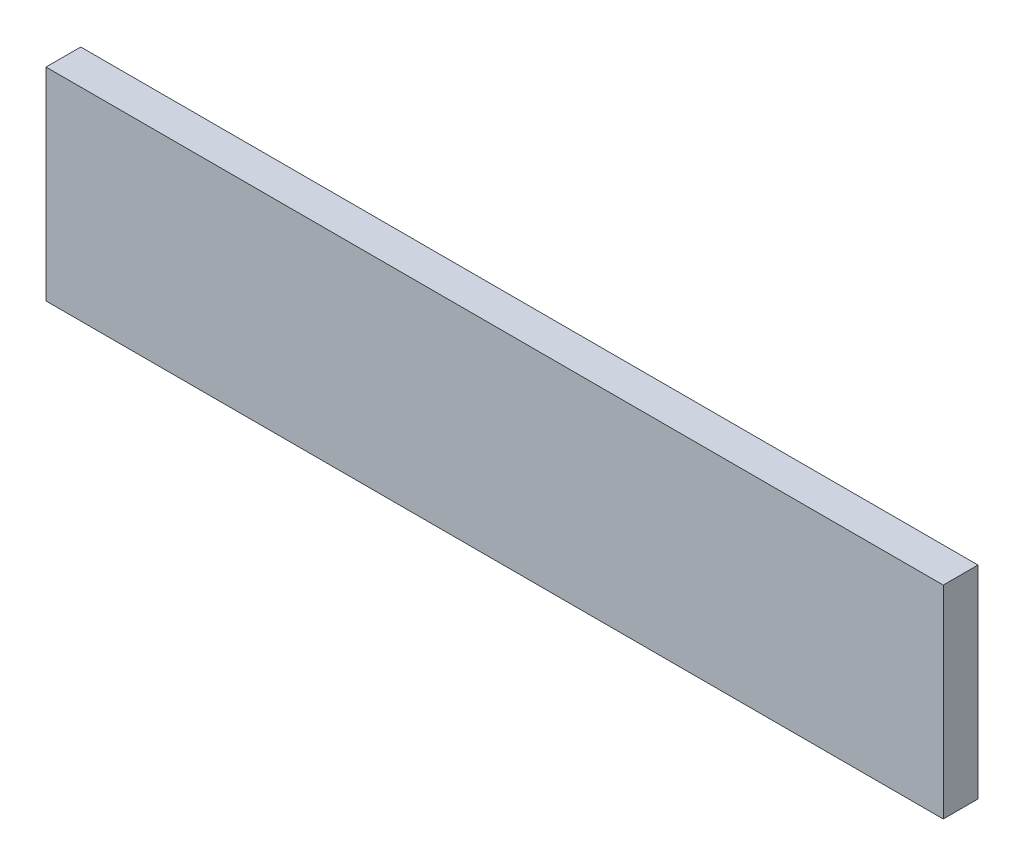
ISO-10303-21;
HEADER;
FILE_DESCRIPTION(('STEP AP214'),'2;1');
FILE_NAME('part.step','',(''),(''),'','','');
FILE_SCHEMA(('AUTOMOTIVE_DESIGN { 1 0 10303 214 1 1 1 1 }'));
ENDSEC;
DATA;
#1=APPLICATION_CONTEXT('core data for automotive mechanical design processes');
#2=APPLICATION_PROTOCOL_DEFINITION('international standard','automotive_design',2000,#1);
#3=PRODUCT_CONTEXT('',#1,'mechanical');
#4=PRODUCT('Part','Part','',(#3));
#5=PRODUCT_RELATED_PRODUCT_CATEGORY('part','',(#4));
#6=PRODUCT_DEFINITION_FORMATION('','',#4);
#7=PRODUCT_DEFINITION_CONTEXT('part definition',#1,'design');
#8=PRODUCT_DEFINITION('design','',#6,#7);
#9=PRODUCT_DEFINITION_SHAPE('','',#8);
#10=(LENGTH_UNIT() NAMED_UNIT(*) SI_UNIT(.MILLI.,.METRE.));
#11=(NAMED_UNIT(*) PLANE_ANGLE_UNIT() SI_UNIT($,.RADIAN.));
#12=(NAMED_UNIT(*) SI_UNIT($,.STERADIAN.) SOLID_ANGLE_UNIT());
#13=UNCERTAINTY_MEASURE_WITH_UNIT(LENGTH_MEASURE(1.E-05),#10,'distance_accuracy_value','');
#14=(GEOMETRIC_REPRESENTATION_CONTEXT(3) GLOBAL_UNCERTAINTY_ASSIGNED_CONTEXT((#13)) GLOBAL_UNIT_ASSIGNED_CONTEXT((#10,
#11,#12)) REPRESENTATION_CONTEXT('',''));
#15=CARTESIAN_POINT('',(0.,0.,0.));
#16=DIRECTION('',(0.,0.,1.));
#17=DIRECTION('',(1.,0.,0.));
#18=AXIS2_PLACEMENT_3D('',#15,#16,#17);
#19=CARTESIAN_POINT('',(0.,0.,12.));
#20=DIRECTION('',(1.,0.,0.));
#21=DIRECTION('',(0.,0.,-1.));
#22=AXIS2_PLACEMENT_3D('',#19,#20,#21);
#23=PLANE('',#22);
#24=DIRECTION('',(0.,-1.,0.));
#25=VECTOR('',#24,1.);
#26=CARTESIAN_POINT('',(0.,0.,0.));
#27=LINE('',#26,#25);
#28=CARTESIAN_POINT('',(0.,70.,0.));
#29=VERTEX_POINT('',#28);
#30=CARTESIAN_POINT('',(0.,0.,0.));
#31=VERTEX_POINT('',#30);
#32=EDGE_CURVE('E95',#29,#31,#27,.T.);
#33=ORIENTED_EDGE('',*,*,#32,.T.);
#34=DIRECTION('',(0.,0.,-1.));
#35=VECTOR('',#34,1.);
#36=CARTESIAN_POINT('',(0.,0.,12.));
#37=LINE('',#36,#35);
#38=CARTESIAN_POINT('',(0.,0.,12.));
#39=VERTEX_POINT('',#38);
#40=EDGE_CURVE('E11',#39,#31,#37,.T.);
#41=ORIENTED_EDGE('',*,*,#40,.F.);
#42=DIRECTION('',(0.,-1.,0.));
#43=VECTOR('',#42,1.);
#44=CARTESIAN_POINT('',(0.,0.,12.));
#45=LINE('',#44,#43);
#46=CARTESIAN_POINT('',(0.,70.,12.));
#47=VERTEX_POINT('',#46);
#48=EDGE_CURVE('E83',#47,#39,#45,.T.);
#49=ORIENTED_EDGE('',*,*,#48,.F.);
#50=DIRECTION('',(0.,0.,-1.));
#51=VECTOR('',#50,1.);
#52=CARTESIAN_POINT('',(0.,70.,12.));
#53=LINE('',#52,#51);
#54=EDGE_CURVE('E91',#47,#29,#53,.T.);
#55=ORIENTED_EDGE('',*,*,#54,.T.);
#56=EDGE_LOOP('',(#33,#41,#49,#55));
#57=FACE_BOUND('',#56,.T.);
#58=ADVANCED_FACE('F32',(#57),#23,.F.);
#59=CARTESIAN_POINT('',(0.,0.,12.));
#60=DIRECTION('',(0.,1.,0.));
#61=DIRECTION('',(0.,0.,1.));
#62=AXIS2_PLACEMENT_3D('',#59,#60,#61);
#63=PLANE('',#62);
#64=DIRECTION('',(1.,0.,0.));
#65=VECTOR('',#64,1.);
#66=CARTESIAN_POINT('',(0.,0.,0.));
#67=LINE('',#66,#65);
#68=CARTESIAN_POINT('',(310.,0.,0.));
#69=VERTEX_POINT('',#68);
#70=EDGE_CURVE('E87',#31,#69,#67,.T.);
#71=ORIENTED_EDGE('',*,*,#70,.T.);
#72=DIRECTION('',(0.,0.,-1.));
#73=VECTOR('',#72,1.);
#74=CARTESIAN_POINT('',(310.,0.,12.));
#75=LINE('',#74,#73);
#76=CARTESIAN_POINT('',(310.,0.,12.));
#77=VERTEX_POINT('',#76);
#78=EDGE_CURVE('E40',#77,#69,#75,.T.);
#79=ORIENTED_EDGE('',*,*,#78,.F.);
#80=DIRECTION('',(1.,0.,0.));
#81=VECTOR('',#80,1.);
#82=CARTESIAN_POINT('',(0.,0.,12.));
#83=LINE('',#82,#81);
#84=EDGE_CURVE('E78',#39,#77,#83,.T.);
#85=ORIENTED_EDGE('',*,*,#84,.F.);
#86=ORIENTED_EDGE('',*,*,#40,.T.);
#87=EDGE_LOOP('',(#71,#79,#85,#86));
#88=FACE_BOUND('',#87,.T.);
#89=ADVANCED_FACE('F86',(#88),#63,.F.);
#90=CARTESIAN_POINT('',(310.,0.,12.));
#91=DIRECTION('',(-1.,0.,0.));
#92=DIRECTION('',(0.,0.,1.));
#93=AXIS2_PLACEMENT_3D('',#90,#91,#92);
#94=PLANE('',#93);
#95=DIRECTION('',(0.,1.,0.));
#96=VECTOR('',#95,1.);
#97=CARTESIAN_POINT('',(310.,0.,0.));
#98=LINE('',#97,#96);
#99=CARTESIAN_POINT('',(310.,70.,0.));
#100=VERTEX_POINT('',#99);
#101=EDGE_CURVE('E65',#69,#100,#98,.T.);
#102=ORIENTED_EDGE('',*,*,#101,.T.);
#103=DIRECTION('',(0.,0.,-1.));
#104=VECTOR('',#103,1.);
#105=CARTESIAN_POINT('',(310.,70.,12.));
#106=LINE('',#105,#104);
#107=CARTESIAN_POINT('',(310.,70.,12.));
#108=VERTEX_POINT('',#107);
#109=EDGE_CURVE('E88',#108,#100,#106,.T.);
#110=ORIENTED_EDGE('',*,*,#109,.F.);
#111=DIRECTION('',(0.,1.,0.));
#112=VECTOR('',#111,1.);
#113=CARTESIAN_POINT('',(310.,0.,12.));
#114=LINE('',#113,#112);
#115=EDGE_CURVE('E81',#77,#108,#114,.T.);
#116=ORIENTED_EDGE('',*,*,#115,.F.);
#117=ORIENTED_EDGE('',*,*,#78,.T.);
#118=EDGE_LOOP('',(#102,#110,#116,#117));
#119=FACE_BOUND('',#118,.T.);
#120=ADVANCED_FACE('F89',(#119),#94,.F.);
#121=CARTESIAN_POINT('',(0.,70.,12.));
#122=DIRECTION('',(0.,-1.,0.));
#123=DIRECTION('',(0.,0.,-1.));
#124=AXIS2_PLACEMENT_3D('',#121,#122,#123);
#125=PLANE('',#124);
#126=DIRECTION('',(-1.,0.,0.));
#127=VECTOR('',#126,1.);
#128=CARTESIAN_POINT('',(0.,70.,0.));
#129=LINE('',#128,#127);
#130=EDGE_CURVE('E71',#100,#29,#129,.T.);
#131=ORIENTED_EDGE('',*,*,#130,.T.);
#132=ORIENTED_EDGE('',*,*,#54,.F.);
#133=DIRECTION('',(-1.,0.,0.));
#134=VECTOR('',#133,1.);
#135=CARTESIAN_POINT('',(0.,70.,12.));
#136=LINE('',#135,#134);
#137=EDGE_CURVE('E48',#108,#47,#136,.T.);
#138=ORIENTED_EDGE('',*,*,#137,.F.);
#139=ORIENTED_EDGE('',*,*,#109,.T.);
#140=EDGE_LOOP('',(#131,#132,#138,#139));
#141=FACE_BOUND('',#140,.T.);
#142=ADVANCED_FACE('F102',(#141),#125,.F.);
#143=CARTESIAN_POINT('',(0.,0.,12.));
#144=DIRECTION('',(0.,0.,-1.));
#145=DIRECTION('',(-1.,0.,0.));
#146=AXIS2_PLACEMENT_3D('',#143,#144,#145);
#147=PLANE('',#146);
#148=ORIENTED_EDGE('',*,*,#48,.T.);
#149=ORIENTED_EDGE('',*,*,#84,.T.);
#150=ORIENTED_EDGE('',*,*,#115,.T.);
#151=ORIENTED_EDGE('',*,*,#137,.T.);
#152=EDGE_LOOP('',(#148,#149,#150,#151));
#153=FACE_BOUND('',#152,.T.);
#154=ADVANCED_FACE('F79',(#153),#147,.F.);
#155=CARTESIAN_POINT('',(0.,0.,0.));
#156=DIRECTION('',(0.,0.,-1.));
#157=DIRECTION('',(-1.,0.,0.));
#158=AXIS2_PLACEMENT_3D('',#155,#156,#157);
#159=PLANE('',#158);
#160=ORIENTED_EDGE('',*,*,#32,.F.);
#161=ORIENTED_EDGE('',*,*,#130,.F.);
#162=ORIENTED_EDGE('',*,*,#101,.F.);
#163=ORIENTED_EDGE('',*,*,#70,.F.);
#164=EDGE_LOOP('',(#160,#161,#162,#163));
#165=FACE_BOUND('',#164,.T.);
#166=ADVANCED_FACE('F105',(#165),#159,.T.);
#167=CLOSED_SHELL('',(#58,#89,#120,#142,#154,#166));
#168=MANIFOLD_SOLID_BREP('B2',#167);
#169=ADVANCED_BREP_SHAPE_REPRESENTATION('',(#18,#168),#14);
#170=SHAPE_DEFINITION_REPRESENTATION(#9,#169);
ENDSEC;
END-ISO-10303-21;
